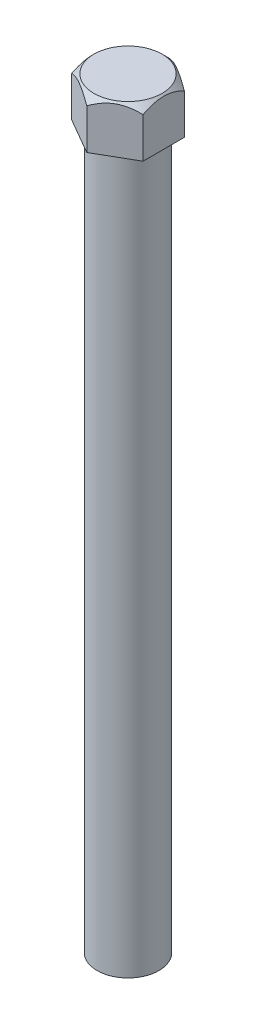
ISO-10303-21;
HEADER;
FILE_DESCRIPTION(('STEP AP214'),'2;1');
FILE_NAME('part.step','',(''),(''),'','','');
FILE_SCHEMA(('AUTOMOTIVE_DESIGN { 1 0 10303 214 1 1 1 1 }'));
ENDSEC;
DATA;
#1=APPLICATION_CONTEXT('core data for automotive mechanical design processes');
#2=APPLICATION_PROTOCOL_DEFINITION('international standard','automotive_design',2000,#1);
#3=PRODUCT_CONTEXT('',#1,'mechanical');
#4=PRODUCT('Part','Part','',(#3));
#5=PRODUCT_RELATED_PRODUCT_CATEGORY('part','',(#4));
#6=PRODUCT_DEFINITION_FORMATION('','',#4);
#7=PRODUCT_DEFINITION_CONTEXT('part definition',#1,'design');
#8=PRODUCT_DEFINITION('design','',#6,#7);
#9=PRODUCT_DEFINITION_SHAPE('','',#8);
#10=(LENGTH_UNIT() NAMED_UNIT(*) SI_UNIT(.MILLI.,.METRE.));
#11=(NAMED_UNIT(*) PLANE_ANGLE_UNIT() SI_UNIT($,.RADIAN.));
#12=(NAMED_UNIT(*) SI_UNIT($,.STERADIAN.) SOLID_ANGLE_UNIT());
#13=UNCERTAINTY_MEASURE_WITH_UNIT(LENGTH_MEASURE(1.E-05),#10,'distance_accuracy_value','');
#14=(GEOMETRIC_REPRESENTATION_CONTEXT(3) GLOBAL_UNCERTAINTY_ASSIGNED_CONTEXT((#13)) GLOBAL_UNIT_ASSIGNED_CONTEXT((#10,
#11,#12)) REPRESENTATION_CONTEXT('',''));
#15=CARTESIAN_POINT('',(0.,0.,0.));
#16=DIRECTION('',(0.,0.,1.));
#17=DIRECTION('',(1.,0.,0.));
#18=AXIS2_PLACEMENT_3D('',#15,#16,#17);
#19=CARTESIAN_POINT('',(0.,3.,0.));
#20=DIRECTION('',(0.,-1.,0.));
#21=DIRECTION('',(0.,0.,-1.));
#22=AXIS2_PLACEMENT_3D('',#19,#20,#21);
#23=CYLINDRICAL_SURFACE('',#22,0.13);
#24=CARTESIAN_POINT('',(0.,3.,0.));
#25=DIRECTION('',(0.,1.,0.));
#26=DIRECTION('',(0.,0.,1.));
#27=AXIS2_PLACEMENT_3D('',#24,#25,#26);
#28=CIRCLE('',#27,0.13);
#29=CARTESIAN_POINT('',(0.,3.,0.13));
#30=VERTEX_POINT('',#29);
#31=EDGE_CURVE('E12',#30,#30,#28,.T.);
#32=ORIENTED_EDGE('',*,*,#31,.F.);
#33=EDGE_LOOP('',(#32));
#34=FACE_BOUND('',#33,.T.);
#35=CARTESIAN_POINT('',(0.,0.,0.));
#36=DIRECTION('',(0.,1.,0.));
#37=DIRECTION('',(0.,0.,1.));
#38=AXIS2_PLACEMENT_3D('',#35,#36,#37);
#39=CIRCLE('',#38,0.13);
#40=CARTESIAN_POINT('',(0.,0.,0.13));
#41=VERTEX_POINT('',#40);
#42=EDGE_CURVE('E44',#41,#41,#39,.T.);
#43=ORIENTED_EDGE('',*,*,#42,.T.);
#44=EDGE_LOOP('',(#43));
#45=FACE_BOUND('',#44,.T.);
#46=ADVANCED_FACE('F41',(#34,#45),#23,.T.);
#47=CARTESIAN_POINT('',(0.,0.,0.));
#48=DIRECTION('',(0.,1.,0.));
#49=DIRECTION('',(0.,0.,1.));
#50=AXIS2_PLACEMENT_3D('',#47,#48,#49);
#51=PLANE('',#50);
#52=ORIENTED_EDGE('',*,*,#42,.F.);
#53=EDGE_LOOP('',(#52));
#54=FACE_BOUND('',#53,.T.);
#55=ADVANCED_FACE('F130',(#54),#51,.F.);
#56=CARTESIAN_POINT('',(0.15,3.2,0.));
#57=DIRECTION('',(-1.,0.,0.));
#58=DIRECTION('',(0.,0.,1.));
#59=AXIS2_PLACEMENT_3D('',#56,#57,#58);
#60=PLANE('',#59);
#61=DIRECTION('',(0.,-1.,0.));
#62=VECTOR('',#61,1.);
#63=CARTESIAN_POINT('',(0.15,3.2,-0.0866025403784438));
#64=LINE('',#63,#62);
#65=CARTESIAN_POINT('',(0.15,3.17,-0.0866025403784438));
#66=VERTEX_POINT('',#65);
#67=CARTESIAN_POINT('',(0.15,3.,-0.0866025403784438));
#68=VERTEX_POINT('',#67);
#69=EDGE_CURVE('E102',#66,#68,#64,.T.);
#70=ORIENTED_EDGE('',*,*,#69,.F.);
#71=CARTESIAN_POINT('',(0.15,3.04079531025542,-0.262586498690913));
#72=CARTESIAN_POINT('',(0.15,3.04753180898604,-0.254826375964097));
#73=CARTESIAN_POINT('',(0.15,3.05422893510501,-0.247031178307719));
#74=CARTESIAN_POINT('',(0.15,3.0675182027981,-0.231345588074377));
#75=CARTESIAN_POINT('',(0.15,3.07411029332349,-0.223455152298885));
#76=CARTESIAN_POINT('',(0.15,3.09397318925053,-0.199257368061424));
#77=CARTESIAN_POINT('',(0.15,3.10702502912681,-0.18277032448999));
#78=CARTESIAN_POINT('',(0.15,3.13211580579962,-0.148967316027862));
#79=CARTESIAN_POINT('',(0.15,3.14415331887066,-0.131650237829541));
#80=CARTESIAN_POINT('',(0.15,3.16043305934934,-0.104665718305433));
#81=CARTESIAN_POINT('',(0.15,3.16554887313006,-0.0955360588615139));
#82=CARTESIAN_POINT('',(0.15,3.17486951186746,-0.0768307253928083));
#83=CARTESIAN_POINT('',(0.15,3.17907600142658,-0.067255906010604));
#84=CARTESIAN_POINT('',(0.15,3.18618311770184,-0.0473652391411257));
#85=CARTESIAN_POINT('',(0.15,3.18905284242856,-0.0370376939426325));
#86=CARTESIAN_POINT('',(0.15,3.1926942585075,-0.0160622657114838));
#87=CARTESIAN_POINT('',(0.15,3.19348025944055,-0.00541707791100083));
#88=CARTESIAN_POINT('',(0.15,3.19275009157281,0.01580555907203));
#89=CARTESIAN_POINT('',(0.15,3.19122989601714,0.0263828573137496));
#90=CARTESIAN_POINT('',(0.15,3.18630245273503,0.0471394448417882));
#91=CARTESIAN_POINT('',(0.15,3.18288056134072,0.0573149809526644));
#92=CARTESIAN_POINT('',(0.15,3.17389745377027,0.0792923162711155));
#93=CARTESIAN_POINT('',(0.15,3.16803227399449,0.0909641323370503));
#94=CARTESIAN_POINT('',(0.15,3.15521226614443,0.113704536639997));
#95=CARTESIAN_POINT('',(0.15,3.14825469801133,0.12477151100399));
#96=CARTESIAN_POINT('',(0.15,3.12637100732597,0.157430248891429));
#97=CARTESIAN_POINT('',(0.15,3.11048964568697,0.178371211639008));
#98=CARTESIAN_POINT('',(0.15,3.08540645403929,0.209758792369404));
#99=CARTESIAN_POINT('',(0.15,3.0765694094161,0.220516380024445));
#100=CARTESIAN_POINT('',(0.15,3.05877647966747,0.241730110309));
#101=CARTESIAN_POINT('',(0.15,3.04982301149958,0.25218827531801));
#102=CARTESIAN_POINT('',(0.15,3.04079531025543,0.262586498690927));
#103=B_SPLINE_CURVE_WITH_KNOTS('',3,(#71,#72,#73,#74,#75,#76,#77,#78,#79,#80,#81,#82,#83,#84,
#85,#86,#87,#88,#89,#90,#91,#92,#93,#94,#95,#96,#97,#98,#99,#100,#101,#102),.UNSPECIFIED.,.F.,
.F.,(4,2,2,2,2,2,2,2,2,2,2,2,2,2,2,4),(0.,0.0308295106196292,0.0616735738810823,
0.124747488513428,0.187908509085987,0.219272585467536,0.250578751447974,0.282576530373673,
0.314353994406208,0.346187007659217,0.378268611399949,0.417354566871307,0.456540176553573,
0.535274804547157,0.577042635629359,0.618345649382721),.UNSPECIFIED.);
#104=CARTESIAN_POINT('',(0.15,3.17,0.0866025403784439));
#105=VERTEX_POINT('',#104);
#106=EDGE_CURVE('E94',#66,#105,#103,.T.);
#107=ORIENTED_EDGE('',*,*,#106,.T.);
#108=DIRECTION('',(0.,-1.,0.));
#109=VECTOR('',#108,1.);
#110=CARTESIAN_POINT('',(0.15,3.2,0.0866025403784439));
#111=LINE('',#110,#109);
#112=CARTESIAN_POINT('',(0.15,3.,0.0866025403784439));
#113=VERTEX_POINT('',#112);
#114=EDGE_CURVE('E63',#105,#113,#111,.T.);
#115=ORIENTED_EDGE('',*,*,#114,.T.);
#116=DIRECTION('',(0.,0.,-1.));
#117=VECTOR('',#116,1.);
#118=CARTESIAN_POINT('',(0.15,3.,0.));
#119=LINE('',#118,#117);
#120=EDGE_CURVE('E103',#113,#68,#119,.T.);
#121=ORIENTED_EDGE('',*,*,#120,.T.);
#122=EDGE_LOOP('',(#70,#107,#115,#121));
#123=FACE_BOUND('',#122,.T.);
#124=ADVANCED_FACE('F101',(#123),#60,.F.);
#125=CARTESIAN_POINT('',(0.075,3.2,-0.129903810567666));
#126=DIRECTION('',(-0.5,0.,0.866025403784439));
#127=DIRECTION('',(0.866025403784439,0.,0.5));
#128=AXIS2_PLACEMENT_3D('',#125,#126,#127);
#129=PLANE('',#128);
#130=DIRECTION('',(0.,-1.,0.));
#131=VECTOR('',#130,1.);
#132=CARTESIAN_POINT('',(0.,3.2,-0.173205080756888));
#133=LINE('',#132,#131);
#134=CARTESIAN_POINT('',(0.,3.17,-0.173205080756888));
#135=VERTEX_POINT('',#134);
#136=CARTESIAN_POINT('',(0.,3.,-0.173205080756888));
#137=VERTEX_POINT('',#136);
#138=EDGE_CURVE('E121',#135,#137,#133,.T.);
#139=ORIENTED_EDGE('',*,*,#138,.F.);
#140=CARTESIAN_POINT('',(-0.000200000000000015,3.16988441455308,-0.173320550810726));
#141=CARTESIAN_POINT('',(0.0049747809267692,3.1728692939954,-0.170332889649658));
#142=CARTESIAN_POINT('',(0.0102254119615123,3.17568184718681,-0.167301436408334));
#143=CARTESIAN_POINT('',(0.0209327733323452,3.18083264194967,-0.161119538438573));
#144=CARTESIAN_POINT('',(0.026390532488324,3.18316800261969,-0.157968499720696));
#145=CARTESIAN_POINT('',(0.0428541982831226,3.18913429872302,-0.148463197842221));
#146=CARTESIAN_POINT('',(0.0541455584959796,3.19184967701747,-0.141944127983811));
#147=CARTESIAN_POINT('',(0.0736819044573412,3.19349253805002,-0.130664813384037));
#148=CARTESIAN_POINT('',(0.0818731081530826,3.19328220421558,-0.125935619725314));
#149=CARTESIAN_POINT('',(0.098088136498022,3.19113971144166,-0.116573868745446));
#150=CARTESIAN_POINT('',(0.106111691270226,3.18920496684668,-0.111941467237856));
#151=CARTESIAN_POINT('',(0.12023195453168,3.18452576928618,-0.103789129442827));
#152=CARTESIAN_POINT('',(0.126392546462714,3.18202131757065,-0.100232310033077));
#153=CARTESIAN_POINT('',(0.138471315396693,3.17637725141577,-0.0932586295375656));
#154=CARTESIAN_POINT('',(0.144390205932563,3.17323969799707,-0.0898413564933771));
#155=CARTESIAN_POINT('',(0.150200000000329,3.1698844145544,-0.0864870703244161));
#156=B_SPLINE_CURVE_WITH_KNOTS('',3,(#140,#141,#142,#143,#144,#145,#146,#147,#148,#149,#150,
#151,#152,#153,#154,#155),.UNSPECIFIED.,.F.,.F.,(4,2,2,2,2,2,2,4),(0.,0.0200322815723705,
0.0401821439649003,0.0797202979159776,0.107933680780694,0.136189439305524,0.158782101417156,
0.181302367981685),.UNSPECIFIED.);
#157=EDGE_CURVE('E104',#135,#66,#156,.T.);
#158=ORIENTED_EDGE('',*,*,#157,.T.);
#159=ORIENTED_EDGE('',*,*,#69,.T.);
#160=DIRECTION('',(-0.866025403784439,0.,-0.5));
#161=VECTOR('',#160,1.);
#162=CARTESIAN_POINT('',(0.075,3.,-0.129903810567666));
#163=LINE('',#162,#161);
#164=EDGE_CURVE('E215',#68,#137,#163,.T.);
#165=ORIENTED_EDGE('',*,*,#164,.T.);
#166=EDGE_LOOP('',(#139,#158,#159,#165));
#167=FACE_BOUND('',#166,.T.);
#168=ADVANCED_FACE('F136',(#167),#129,.F.);
#169=CARTESIAN_POINT('',(-0.075,3.2,-0.129903810567666));
#170=DIRECTION('',(0.5,0.,0.866025403784439));
#171=DIRECTION('',(0.866025403784439,0.,-0.5));
#172=AXIS2_PLACEMENT_3D('',#169,#170,#171);
#173=PLANE('',#172);
#174=DIRECTION('',(0.,-1.,0.));
#175=VECTOR('',#174,1.);
#176=CARTESIAN_POINT('',(-0.15,3.2,-0.0866025403784439));
#177=LINE('',#176,#175);
#178=CARTESIAN_POINT('',(-0.15,3.17,-0.0866025403784439));
#179=VERTEX_POINT('',#178);
#180=CARTESIAN_POINT('',(-0.15,3.,-0.0866025403784439));
#181=VERTEX_POINT('',#180);
#182=EDGE_CURVE('E119',#179,#181,#177,.T.);
#183=ORIENTED_EDGE('',*,*,#182,.F.);
#184=CARTESIAN_POINT('',(-0.1502,3.16988441455308,-0.0864870703246059));
#185=CARTESIAN_POINT('',(-0.145025219073231,3.1728692939954,-0.0894747314856735));
#186=CARTESIAN_POINT('',(-0.139774588038488,3.17568184718681,-0.0925061847269978));
#187=CARTESIAN_POINT('',(-0.129067226667655,3.18083264194967,-0.0986880826967587));
#188=CARTESIAN_POINT('',(-0.123609467511676,3.18316800261969,-0.101839121414635));
#189=CARTESIAN_POINT('',(-0.107145801716877,3.18913429872302,-0.11134442329311));
#190=CARTESIAN_POINT('',(-0.0958544415040204,3.19184967701747,-0.11786349315152));
#191=CARTESIAN_POINT('',(-0.0763180955426588,3.19349253805002,-0.129142807751294));
#192=CARTESIAN_POINT('',(-0.0681268918469173,3.19328220421558,-0.133872001410017));
#193=CARTESIAN_POINT('',(-0.0519118635019779,3.19113971144166,-0.143233752389886));
#194=CARTESIAN_POINT('',(-0.0438883087297738,3.18920496684668,-0.147866153897475));
#195=CARTESIAN_POINT('',(-0.0297680454683196,3.18452576928618,-0.156018491692504));
#196=CARTESIAN_POINT('',(-0.0236074535372858,3.18202131757065,-0.159575311102254));
#197=CARTESIAN_POINT('',(-0.0115286846033072,3.17637725141577,-0.166548991597766));
#198=CARTESIAN_POINT('',(-0.00560979406743727,3.17323969799707,-0.169966264641954));
#199=CARTESIAN_POINT('',(0.000200000000328776,3.1698844145544,-0.173320550810915));
#200=B_SPLINE_CURVE_WITH_KNOTS('',3,(#184,#185,#186,#187,#188,#189,#190,#191,#192,#193,#194,
#195,#196,#197,#198,#199),.UNSPECIFIED.,.F.,.F.,(4,2,2,2,2,2,2,4),(0.,0.0200322815723705,
0.0401821439649002,0.0797202979159776,0.107933680780694,0.136189439305524,0.158782101417156,
0.181302367981686),.UNSPECIFIED.);
#201=EDGE_CURVE('E187',#179,#135,#200,.T.);
#202=ORIENTED_EDGE('',*,*,#201,.T.);
#203=ORIENTED_EDGE('',*,*,#138,.T.);
#204=DIRECTION('',(-0.866025403784439,0.,0.5));
#205=VECTOR('',#204,1.);
#206=CARTESIAN_POINT('',(-0.075,3.,-0.129903810567666));
#207=LINE('',#206,#205);
#208=EDGE_CURVE('E216',#137,#181,#207,.T.);
#209=ORIENTED_EDGE('',*,*,#208,.T.);
#210=EDGE_LOOP('',(#183,#202,#203,#209));
#211=FACE_BOUND('',#210,.T.);
#212=ADVANCED_FACE('F193',(#211),#173,.F.);
#213=CARTESIAN_POINT('',(-0.15,3.2,0.));
#214=DIRECTION('',(1.,0.,0.));
#215=DIRECTION('',(0.,0.,-1.));
#216=AXIS2_PLACEMENT_3D('',#213,#214,#215);
#217=PLANE('',#216);
#218=DIRECTION('',(0.,-1.,0.));
#219=VECTOR('',#218,1.);
#220=CARTESIAN_POINT('',(-0.15,3.2,0.0866025403784439));
#221=LINE('',#220,#219);
#222=CARTESIAN_POINT('',(-0.15,3.17,0.0866025403784438));
#223=VERTEX_POINT('',#222);
#224=CARTESIAN_POINT('',(-0.15,3.,0.0866025403784439));
#225=VERTEX_POINT('',#224);
#226=EDGE_CURVE('E112',#223,#225,#221,.T.);
#227=ORIENTED_EDGE('',*,*,#226,.F.);
#228=CARTESIAN_POINT('',(-0.15,3.04079531025542,0.262586498690913));
#229=CARTESIAN_POINT('',(-0.15,3.04753180898604,0.254826375964097));
#230=CARTESIAN_POINT('',(-0.15,3.05422893510501,0.247031178307719));
#231=CARTESIAN_POINT('',(-0.15,3.0675182027981,0.231345588074377));
#232=CARTESIAN_POINT('',(-0.15,3.07411029332349,0.223455152298885));
#233=CARTESIAN_POINT('',(-0.15,3.09397318925053,0.199257368061424));
#234=CARTESIAN_POINT('',(-0.15,3.10702502912681,0.18277032448999));
#235=CARTESIAN_POINT('',(-0.15,3.13211580579962,0.148967316027862));
#236=CARTESIAN_POINT('',(-0.15,3.14415331887066,0.131650237829541));
#237=CARTESIAN_POINT('',(-0.15,3.16043305934934,0.104665718305433));
#238=CARTESIAN_POINT('',(-0.15,3.16554887313006,0.0955360588615139));
#239=CARTESIAN_POINT('',(-0.15,3.17486951186746,0.0768307253928083));
#240=CARTESIAN_POINT('',(-0.15,3.17907600142658,0.067255906010604));
#241=CARTESIAN_POINT('',(-0.15,3.18618311770184,0.0473652391411257));
#242=CARTESIAN_POINT('',(-0.15,3.18905284242856,0.0370376939426325));
#243=CARTESIAN_POINT('',(-0.15,3.1926942585075,0.0160622657114839));
#244=CARTESIAN_POINT('',(-0.15,3.19348025944055,0.00541707791100092));
#245=CARTESIAN_POINT('',(-0.15,3.19275009157281,-0.0158055590720299));
#246=CARTESIAN_POINT('',(-0.15,3.19122989601714,-0.0263828573137495));
#247=CARTESIAN_POINT('',(-0.15,3.18630245273503,-0.0471394448417881));
#248=CARTESIAN_POINT('',(-0.15,3.18288056134072,-0.0573149809526643));
#249=CARTESIAN_POINT('',(-0.15,3.17389745377027,-0.0792923162711154));
#250=CARTESIAN_POINT('',(-0.15,3.16803227399449,-0.0909641323370501));
#251=CARTESIAN_POINT('',(-0.15,3.15521226614443,-0.113704536639997));
#252=CARTESIAN_POINT('',(-0.15,3.14825469801133,-0.12477151100399));
#253=CARTESIAN_POINT('',(-0.15,3.12637100732597,-0.157430248891429));
#254=CARTESIAN_POINT('',(-0.15,3.11048964568697,-0.178371211639008));
#255=CARTESIAN_POINT('',(-0.15,3.08540645403929,-0.209758792369404));
#256=CARTESIAN_POINT('',(-0.15,3.0765694094161,-0.220516380024445));
#257=CARTESIAN_POINT('',(-0.15,3.05877647966747,-0.241730110308999));
#258=CARTESIAN_POINT('',(-0.15,3.04982301149958,-0.25218827531801));
#259=CARTESIAN_POINT('',(-0.15,3.04079531025543,-0.262586498690927));
#260=B_SPLINE_CURVE_WITH_KNOTS('',3,(#228,#229,#230,#231,#232,#233,#234,#235,#236,#237,#238,
#239,#240,#241,#242,#243,#244,#245,#246,#247,#248,#249,#250,#251,#252,#253,#254,#255,#256,#257,
#258,#259),.UNSPECIFIED.,.F.,.F.,(4,2,2,2,2,2,2,2,2,2,2,2,2,2,2,4),(0.,0.0308295106196292,
0.0616735738810822,0.124747488513428,0.187908509085987,0.219272585467537,0.250578751447974,
0.282576530373673,0.314353994406208,0.346187007659216,0.378268611399949,0.417354566871307,
0.456540176553573,0.535274804547157,0.577042635629358,0.618345649382721),.UNSPECIFIED.);
#261=EDGE_CURVE('E181',#223,#179,#260,.T.);
#262=ORIENTED_EDGE('',*,*,#261,.T.);
#263=ORIENTED_EDGE('',*,*,#182,.T.);
#264=DIRECTION('',(0.,0.,1.));
#265=VECTOR('',#264,1.);
#266=CARTESIAN_POINT('',(-0.15,3.,0.));
#267=LINE('',#266,#265);
#268=EDGE_CURVE('E219',#181,#225,#267,.T.);
#269=ORIENTED_EDGE('',*,*,#268,.T.);
#270=EDGE_LOOP('',(#227,#262,#263,#269));
#271=FACE_BOUND('',#270,.T.);
#272=ADVANCED_FACE('F196',(#271),#217,.F.);
#273=CARTESIAN_POINT('',(-0.075,3.2,0.129903810567666));
#274=DIRECTION('',(0.5,0.,-0.866025403784439));
#275=DIRECTION('',(-0.866025403784439,0.,-0.5));
#276=AXIS2_PLACEMENT_3D('',#273,#274,#275);
#277=PLANE('',#276);
#278=DIRECTION('',(0.,-1.,0.));
#279=VECTOR('',#278,1.);
#280=CARTESIAN_POINT('',(0.,3.2,0.173205080756888));
#281=LINE('',#280,#279);
#282=CARTESIAN_POINT('',(0.,3.17,0.173205080756888));
#283=VERTEX_POINT('',#282);
#284=CARTESIAN_POINT('',(0.,3.,0.173205080756888));
#285=VERTEX_POINT('',#284);
#286=EDGE_CURVE('E110',#283,#285,#281,.T.);
#287=ORIENTED_EDGE('',*,*,#286,.F.);
#288=CARTESIAN_POINT('',(0.000200000000000013,3.16988441455308,0.173320550810726));
#289=CARTESIAN_POINT('',(-0.00497478092676914,3.1728692939954,0.170332889649658));
#290=CARTESIAN_POINT('',(-0.0102254119615122,3.17568184718681,0.167301436408334));
#291=CARTESIAN_POINT('',(-0.0209327733323452,3.18083264194967,0.161119538438573));
#292=CARTESIAN_POINT('',(-0.0263905324883241,3.18316800261969,0.157968499720696));
#293=CARTESIAN_POINT('',(-0.0428541982831226,3.18913429872302,0.148463197842221));
#294=CARTESIAN_POINT('',(-0.0541455584959796,3.19184967701747,0.141944127983811));
#295=CARTESIAN_POINT('',(-0.0736819044573411,3.19349253805002,0.130664813384038));
#296=CARTESIAN_POINT('',(-0.0818731081530826,3.19328220421558,0.125935619725314));
#297=CARTESIAN_POINT('',(-0.098088136498022,3.19113971144166,0.116573868745446));
#298=CARTESIAN_POINT('',(-0.106111691270226,3.18920496684668,0.111941467237856));
#299=CARTESIAN_POINT('',(-0.12023195453168,3.18452576928618,0.103789129442827));
#300=CARTESIAN_POINT('',(-0.126392546462714,3.18202131757065,0.100232310033077));
#301=CARTESIAN_POINT('',(-0.138471315396693,3.17637725141577,0.0932586295375655));
#302=CARTESIAN_POINT('',(-0.144390205932563,3.17323969799707,0.0898413564933771));
#303=CARTESIAN_POINT('',(-0.150200000000329,3.1698844145544,0.0864870703244161));
#304=B_SPLINE_CURVE_WITH_KNOTS('',3,(#288,#289,#290,#291,#292,#293,#294,#295,#296,#297,#298,
#299,#300,#301,#302,#303),.UNSPECIFIED.,.F.,.F.,(4,2,2,2,2,2,2,4),(0.,0.0200322815723704,
0.0401821439649004,0.0797202979159777,0.107933680780694,0.136189439305524,0.158782101417157,
0.181302367981686),.UNSPECIFIED.);
#305=EDGE_CURVE('E55',#283,#223,#304,.T.);
#306=ORIENTED_EDGE('',*,*,#305,.T.);
#307=ORIENTED_EDGE('',*,*,#226,.T.);
#308=DIRECTION('',(0.866025403784439,0.,0.5));
#309=VECTOR('',#308,1.);
#310=CARTESIAN_POINT('',(-0.075,3.,0.129903810567666));
#311=LINE('',#310,#309);
#312=EDGE_CURVE('E114',#225,#285,#311,.T.);
#313=ORIENTED_EDGE('',*,*,#312,.T.);
#314=EDGE_LOOP('',(#287,#306,#307,#313));
#315=FACE_BOUND('',#314,.T.);
#316=ADVANCED_FACE('F200',(#315),#277,.F.);
#317=CARTESIAN_POINT('',(0.075,3.2,0.129903810567666));
#318=DIRECTION('',(-0.5,0.,-0.866025403784439));
#319=DIRECTION('',(-0.866025403784439,0.,0.5));
#320=AXIS2_PLACEMENT_3D('',#317,#318,#319);
#321=PLANE('',#320);
#322=ORIENTED_EDGE('',*,*,#114,.F.);
#323=CARTESIAN_POINT('',(0.1502,3.16988441455308,0.086487070324606));
#324=CARTESIAN_POINT('',(0.145025219073231,3.1728692939954,0.0894747314856736));
#325=CARTESIAN_POINT('',(0.139774588038488,3.17568184718681,0.0925061847269979));
#326=CARTESIAN_POINT('',(0.129067226667655,3.18083264194967,0.0986880826967589));
#327=CARTESIAN_POINT('',(0.123609467511676,3.18316800261969,0.101839121414635));
#328=CARTESIAN_POINT('',(0.107145801716877,3.18913429872302,0.11134442329311));
#329=CARTESIAN_POINT('',(0.0958544415040204,3.19184967701747,0.11786349315152));
#330=CARTESIAN_POINT('',(0.0763180955426589,3.19349253805002,0.129142807751294));
#331=CARTESIAN_POINT('',(0.0681268918469174,3.19328220421558,0.133872001410017));
#332=CARTESIAN_POINT('',(0.0519118635019781,3.19113971144166,0.143233752389886));
#333=CARTESIAN_POINT('',(0.0438883087297739,3.18920496684668,0.147866153897475));
#334=CARTESIAN_POINT('',(0.0297680454683197,3.18452576928618,0.156018491692504));
#335=CARTESIAN_POINT('',(0.0236074535372859,3.18202131757065,0.159575311102254));
#336=CARTESIAN_POINT('',(0.0115286846033073,3.17637725141577,0.166548991597766));
#337=CARTESIAN_POINT('',(0.00560979406743731,3.17323969799707,0.169966264641954));
#338=CARTESIAN_POINT('',(-0.000200000000328803,3.1698844145544,0.173320550810915));
#339=B_SPLINE_CURVE_WITH_KNOTS('',3,(#323,#324,#325,#326,#327,#328,#329,#330,#331,#332,#333,
#334,#335,#336,#337,#338),.UNSPECIFIED.,.F.,.F.,(4,2,2,2,2,2,2,4),(0.,0.0200322815723705,
0.0401821439649005,0.0797202979159776,0.107933680780694,0.136189439305524,0.158782101417156,
0.181302367981686),.UNSPECIFIED.);
#340=EDGE_CURVE('E92',#105,#283,#339,.T.);
#341=ORIENTED_EDGE('',*,*,#340,.T.);
#342=ORIENTED_EDGE('',*,*,#286,.T.);
#343=DIRECTION('',(0.866025403784439,0.,-0.5));
#344=VECTOR('',#343,1.);
#345=CARTESIAN_POINT('',(0.075,3.,0.129903810567666));
#346=LINE('',#345,#344);
#347=EDGE_CURVE('E108',#285,#113,#346,.T.);
#348=ORIENTED_EDGE('',*,*,#347,.T.);
#349=EDGE_LOOP('',(#322,#341,#342,#348));
#350=FACE_BOUND('',#349,.T.);
#351=ADVANCED_FACE('F106',(#350),#321,.F.);
#352=CARTESIAN_POINT('',(0.,3.,0.));
#353=DIRECTION('',(0.,1.,0.));
#354=DIRECTION('',(0.,0.,1.));
#355=AXIS2_PLACEMENT_3D('',#352,#353,#354);
#356=PLANE('',#355);
#357=ORIENTED_EDGE('',*,*,#31,.T.);
#358=EDGE_LOOP('',(#357));
#359=FACE_BOUND('',#358,.T.);
#360=ORIENTED_EDGE('',*,*,#120,.F.);
#361=ORIENTED_EDGE('',*,*,#347,.F.);
#362=ORIENTED_EDGE('',*,*,#312,.F.);
#363=ORIENTED_EDGE('',*,*,#268,.F.);
#364=ORIENTED_EDGE('',*,*,#208,.F.);
#365=ORIENTED_EDGE('',*,*,#164,.F.);
#366=EDGE_LOOP('',(#360,#361,#362,#363,#364,#365));
#367=FACE_BOUND('',#366,.T.);
#368=ADVANCED_FACE('F160',(#359,#367),#356,.F.);
#369=CARTESIAN_POINT('',(0.,3.17,0.));
#370=DIRECTION('',(0.,-1.,0.));
#371=DIRECTION('',(0.,0.,-1.));
#372=AXIS2_PLACEMENT_3D('',#369,#370,#371);
#373=CONICAL_SURFACE('',#372,0.173205080756888,0.785398163397447);
#374=CARTESIAN_POINT('',(0.,3.2,0.));
#375=DIRECTION('',(0.,1.,0.));
#376=DIRECTION('',(0.,0.,1.));
#377=AXIS2_PLACEMENT_3D('',#374,#375,#376);
#378=CIRCLE('',#377,0.143205080756888);
#379=CARTESIAN_POINT('',(0.,3.2,0.143205080756888));
#380=VERTEX_POINT('',#379);
#381=EDGE_CURVE('E98',#380,#380,#378,.T.);
#382=ORIENTED_EDGE('',*,*,#381,.F.);
#383=EDGE_LOOP('',(#382));
#384=FACE_BOUND('',#383,.T.);
#385=ORIENTED_EDGE('',*,*,#157,.F.);
#386=ORIENTED_EDGE('',*,*,#201,.F.);
#387=ORIENTED_EDGE('',*,*,#261,.F.);
#388=ORIENTED_EDGE('',*,*,#305,.F.);
#389=ORIENTED_EDGE('',*,*,#340,.F.);
#390=ORIENTED_EDGE('',*,*,#106,.F.);
#391=EDGE_LOOP('',(#385,#386,#387,#388,#389,#390));
#392=FACE_BOUND('',#391,.T.);
#393=ADVANCED_FACE('F93',(#384,#392),#373,.T.);
#394=CARTESIAN_POINT('',(0.,3.2,0.));
#395=DIRECTION('',(0.,1.,0.));
#396=DIRECTION('',(0.,0.,1.));
#397=AXIS2_PLACEMENT_3D('',#394,#395,#396);
#398=PLANE('',#397);
#399=ORIENTED_EDGE('',*,*,#381,.T.);
#400=EDGE_LOOP('',(#399));
#401=FACE_BOUND('',#400,.T.);
#402=ADVANCED_FACE('F159',(#401),#398,.T.);
#403=CLOSED_SHELL('',(#46,#55,#124,#168,#212,#272,#316,#351,#368,#393,#402));
#404=MANIFOLD_SOLID_BREP('B2',#403);
#405=ADVANCED_BREP_SHAPE_REPRESENTATION('',(#18,#404),#14);
#406=SHAPE_DEFINITION_REPRESENTATION(#9,#405);
ENDSEC;
END-ISO-10303-21;
